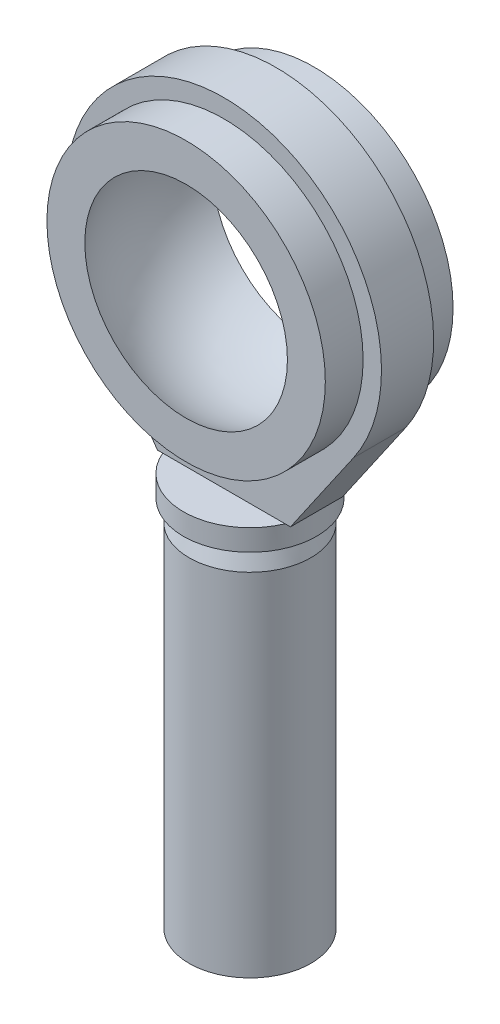
ISO-10303-21;
HEADER;
FILE_DESCRIPTION(('STEP AP214'),'2;1');
FILE_NAME('part.step','',(''),(''),'','','');
FILE_SCHEMA(('AUTOMOTIVE_DESIGN { 1 0 10303 214 1 1 1 1 }'));
ENDSEC;
DATA;
#1=APPLICATION_CONTEXT('core data for automotive mechanical design processes');
#2=APPLICATION_PROTOCOL_DEFINITION('international standard','automotive_design',2000,#1);
#3=PRODUCT_CONTEXT('',#1,'mechanical');
#4=PRODUCT('Part','Part','',(#3));
#5=PRODUCT_RELATED_PRODUCT_CATEGORY('part','',(#4));
#6=PRODUCT_DEFINITION_FORMATION('','',#4);
#7=PRODUCT_DEFINITION_CONTEXT('part definition',#1,'design');
#8=PRODUCT_DEFINITION('design','',#6,#7);
#9=PRODUCT_DEFINITION_SHAPE('','',#8);
#10=(LENGTH_UNIT() NAMED_UNIT(*) SI_UNIT(.MILLI.,.METRE.));
#11=(NAMED_UNIT(*) PLANE_ANGLE_UNIT() SI_UNIT($,.RADIAN.));
#12=(NAMED_UNIT(*) SI_UNIT($,.STERADIAN.) SOLID_ANGLE_UNIT());
#13=UNCERTAINTY_MEASURE_WITH_UNIT(LENGTH_MEASURE(1.E-05),#10,'distance_accuracy_value','');
#14=(GEOMETRIC_REPRESENTATION_CONTEXT(3) GLOBAL_UNCERTAINTY_ASSIGNED_CONTEXT((#13)) GLOBAL_UNIT_ASSIGNED_CONTEXT((#10,
#11,#12)) REPRESENTATION_CONTEXT('',''));
#15=CARTESIAN_POINT('',(0.,0.,0.));
#16=DIRECTION('',(0.,0.,1.));
#17=DIRECTION('',(1.,0.,0.));
#18=AXIS2_PLACEMENT_3D('',#15,#16,#17);
#19=CARTESIAN_POINT('',(0.,-54.,0.));
#20=DIRECTION('',(0.,1.,0.));
#21=DIRECTION('',(-1.,0.,0.));
#22=AXIS2_PLACEMENT_3D('',#19,#20,#21);
#23=PLANE('',#22);
#24=CARTESIAN_POINT('',(0.,-54.,0.));
#25=DIRECTION('',(0.,1.,0.));
#26=DIRECTION('',(-1.,0.,0.));
#27=AXIS2_PLACEMENT_3D('',#24,#25,#26);
#28=CIRCLE('',#27,5.725);
#29=CARTESIAN_POINT('',(-5.725,-54.,0.));
#30=VERTEX_POINT('',#29);
#31=EDGE_CURVE('E11',#30,#30,#28,.T.);
#32=ORIENTED_EDGE('',*,*,#31,.F.);
#33=EDGE_LOOP('',(#32));
#34=FACE_BOUND('',#33,.T.);
#35=ADVANCED_FACE('F43',(#34),#23,.F.);
#36=CARTESIAN_POINT('',(0.,-19.,0.));
#37=DIRECTION('',(0.,1.,0.));
#38=DIRECTION('',(-1.,0.,0.));
#39=AXIS2_PLACEMENT_3D('',#36,#37,#38);
#40=CYLINDRICAL_SURFACE('',#39,5.725);
#41=CARTESIAN_POINT('',(0.,-21.,0.));
#42=DIRECTION('',(0.,1.,0.));
#43=DIRECTION('',(-1.,0.,0.));
#44=AXIS2_PLACEMENT_3D('',#41,#42,#43);
#45=CIRCLE('',#44,5.725);
#46=CARTESIAN_POINT('',(-5.725,-21.,0.));
#47=VERTEX_POINT('',#46);
#48=EDGE_CURVE('E49',#47,#47,#45,.T.);
#49=ORIENTED_EDGE('',*,*,#48,.F.);
#50=EDGE_LOOP('',(#49));
#51=FACE_BOUND('',#50,.T.);
#52=ORIENTED_EDGE('',*,*,#31,.T.);
#53=EDGE_LOOP('',(#52));
#54=FACE_BOUND('',#53,.T.);
#55=ADVANCED_FACE('F64',(#51,#54),#40,.T.);
#56=CARTESIAN_POINT('',(0.,-21.,0.));
#57=DIRECTION('',(0.,-1.,0.));
#58=DIRECTION('',(1.,0.,0.));
#59=AXIS2_PLACEMENT_3D('',#56,#57,#58);
#60=CONICAL_SURFACE('',#59,5.725,0.325495855236479);
#61=CARTESIAN_POINT('',(0.,-19.,0.));
#62=DIRECTION('',(0.,1.,0.));
#63=DIRECTION('',(-1.,0.,0.));
#64=AXIS2_PLACEMENT_3D('',#61,#62,#63);
#65=CIRCLE('',#64,5.05);
#66=CARTESIAN_POINT('',(-5.05,-19.,0.));
#67=VERTEX_POINT('',#66);
#68=EDGE_CURVE('E53',#67,#67,#65,.T.);
#69=ORIENTED_EDGE('',*,*,#68,.F.);
#70=EDGE_LOOP('',(#69));
#71=FACE_BOUND('',#70,.T.);
#72=ORIENTED_EDGE('',*,*,#48,.T.);
#73=EDGE_LOOP('',(#72));
#74=FACE_BOUND('',#73,.T.);
#75=ADVANCED_FACE('F62',(#71,#74),#60,.T.);
#76=CARTESIAN_POINT('',(0.,-19.,0.));
#77=DIRECTION('',(0.,-1.,0.));
#78=DIRECTION('',(1.,0.,0.));
#79=AXIS2_PLACEMENT_3D('',#76,#77,#78);
#80=PLANE('',#79);
#81=ORIENTED_EDGE('',*,*,#68,.T.);
#82=EDGE_LOOP('',(#81));
#83=FACE_BOUND('',#82,.T.);
#84=ADVANCED_FACE('F60',(#83),#80,.F.);
#85=CLOSED_SHELL('',(#35,#55,#75,#84));
#86=MANIFOLD_SOLID_BREP('B2',#85);
#87=CARTESIAN_POINT('',(0.,-17.,0.));
#88=DIRECTION('',(0.,1.,0.));
#89=DIRECTION('',(0.,0.,1.));
#90=AXIS2_PLACEMENT_3D('',#87,#88,#89);
#91=PLANE('',#90);
#92=CARTESIAN_POINT('',(0.,-17.,0.));
#93=DIRECTION('',(0.,1.,0.));
#94=DIRECTION('',(0.,0.,1.));
#95=AXIS2_PLACEMENT_3D('',#92,#93,#94);
#96=CIRCLE('',#95,6.25);
#97=CARTESIAN_POINT('',(5.74978260458602,-17.,-2.45));
#98=VERTEX_POINT('',#97);
#99=CARTESIAN_POINT('',(-5.74978260458602,-17.,-2.45));
#100=VERTEX_POINT('',#99);
#101=EDGE_CURVE('E234',#98,#100,#96,.T.);
#102=ORIENTED_EDGE('',*,*,#101,.T.);
#103=DIRECTION('',(1.,0.,0.));
#104=VECTOR('',#103,1.);
#105=CARTESIAN_POINT('',(6.25,-17.,-2.45));
#106=LINE('',#105,#104);
#107=EDGE_CURVE('E41',#100,#98,#106,.T.);
#108=ORIENTED_EDGE('',*,*,#107,.T.);
#109=EDGE_LOOP('',(#102,#108));
#110=FACE_BOUND('',#109,.T.);
#111=ADVANCED_FACE('F99',(#110),#91,.T.);
#112=CARTESIAN_POINT('',(0.,-17.,0.));
#113=DIRECTION('',(0.,-1.,0.));
#114=DIRECTION('',(0.,0.,-1.));
#115=AXIS2_PLACEMENT_3D('',#112,#113,#114);
#116=CYLINDRICAL_SURFACE('',#115,6.25);
#117=CARTESIAN_POINT('',(5.74978260458602,-17.,2.45));
#118=VERTEX_POINT('',#117);
#119=CARTESIAN_POINT('',(6.25,-17.,0.));
#120=VERTEX_POINT('',#119);
#121=EDGE_CURVE('E225',#118,#120,#96,.T.);
#122=ORIENTED_EDGE('',*,*,#121,.F.);
#123=CARTESIAN_POINT('',(-5.74978260458602,-17.,2.45));
#124=VERTEX_POINT('',#123);
#125=EDGE_CURVE('E228',#124,#118,#96,.T.);
#126=ORIENTED_EDGE('',*,*,#125,.F.);
#127=CARTESIAN_POINT('',(-6.25,-17.,0.));
#128=VERTEX_POINT('',#127);
#129=EDGE_CURVE('E123',#128,#124,#96,.T.);
#130=ORIENTED_EDGE('',*,*,#129,.F.);
#131=EDGE_CURVE('E235',#100,#128,#96,.T.);
#132=ORIENTED_EDGE('',*,*,#131,.F.);
#133=ORIENTED_EDGE('',*,*,#101,.F.);
#134=EDGE_CURVE('E227',#120,#98,#96,.T.);
#135=ORIENTED_EDGE('',*,*,#134,.F.);
#136=EDGE_LOOP('',(#122,#126,#130,#132,#133,#135));
#137=FACE_BOUND('',#136,.T.);
#138=CARTESIAN_POINT('',(0.,-19.,0.));
#139=DIRECTION('',(0.,1.,0.));
#140=DIRECTION('',(0.,0.,1.));
#141=AXIS2_PLACEMENT_3D('',#138,#139,#140);
#142=CIRCLE('',#141,6.25);
#143=CARTESIAN_POINT('',(0.,-19.,6.25));
#144=VERTEX_POINT('',#143);
#145=EDGE_CURVE('E103',#144,#144,#142,.T.);
#146=ORIENTED_EDGE('',*,*,#145,.T.);
#147=EDGE_LOOP('',(#146));
#148=FACE_BOUND('',#147,.T.);
#149=ADVANCED_FACE('F101',(#137,#148),#116,.T.);
#150=DIRECTION('',(1.,0.,0.));
#151=VECTOR('',#150,1.);
#152=CARTESIAN_POINT('',(6.25,-17.,2.45));
#153=LINE('',#152,#151);
#154=EDGE_CURVE('E108',#124,#118,#153,.T.);
#155=ORIENTED_EDGE('',*,*,#154,.F.);
#156=ORIENTED_EDGE('',*,*,#125,.T.);
#157=EDGE_LOOP('',(#155,#156));
#158=FACE_BOUND('',#157,.T.);
#159=ADVANCED_FACE('F243',(#158),#91,.T.);
#160=CARTESIAN_POINT('',(0.,-19.,0.));
#161=DIRECTION('',(0.,1.,0.));
#162=DIRECTION('',(0.,0.,1.));
#163=AXIS2_PLACEMENT_3D('',#160,#161,#162);
#164=PLANE('',#163);
#165=ORIENTED_EDGE('',*,*,#145,.F.);
#166=EDGE_LOOP('',(#165));
#167=FACE_BOUND('',#166,.T.);
#168=ADVANCED_FACE('F240',(#167),#164,.F.);
#169=CARTESIAN_POINT('',(6.25,-17.,2.45));
#170=DIRECTION('',(0.,1.,0.));
#171=DIRECTION('',(0.,0.,1.));
#172=AXIS2_PLACEMENT_3D('',#169,#170,#171);
#173=PLANE('',#172);
#174=CARTESIAN_POINT('',(6.25,-17.,2.45));
#175=VERTEX_POINT('',#174);
#176=EDGE_CURVE('E213',#118,#175,#153,.T.);
#177=ORIENTED_EDGE('',*,*,#176,.F.);
#178=ORIENTED_EDGE('',*,*,#121,.T.);
#179=DIRECTION('',(0.,0.,-1.));
#180=VECTOR('',#179,1.);
#181=CARTESIAN_POINT('',(6.25,-17.,2.45));
#182=LINE('',#181,#180);
#183=EDGE_CURVE('E219',#175,#120,#182,.T.);
#184=ORIENTED_EDGE('',*,*,#183,.F.);
#185=EDGE_LOOP('',(#177,#178,#184));
#186=FACE_BOUND('',#185,.T.);
#187=ADVANCED_FACE('F242',(#186),#173,.F.);
#188=CARTESIAN_POINT('',(6.25,-17.,-2.45));
#189=VERTEX_POINT('',#188);
#190=EDGE_CURVE('E217',#120,#189,#182,.T.);
#191=ORIENTED_EDGE('',*,*,#190,.F.);
#192=ORIENTED_EDGE('',*,*,#134,.T.);
#193=EDGE_CURVE('E111',#98,#189,#106,.T.);
#194=ORIENTED_EDGE('',*,*,#193,.T.);
#195=EDGE_LOOP('',(#191,#192,#194));
#196=FACE_BOUND('',#195,.T.);
#197=ADVANCED_FACE('F248',(#196),#173,.F.);
#198=CARTESIAN_POINT('',(-6.25,-17.,-2.45));
#199=VERTEX_POINT('',#198);
#200=EDGE_CURVE('E110',#199,#100,#106,.T.);
#201=ORIENTED_EDGE('',*,*,#200,.T.);
#202=ORIENTED_EDGE('',*,*,#131,.T.);
#203=DIRECTION('',(0.,0.,-1.));
#204=VECTOR('',#203,1.);
#205=CARTESIAN_POINT('',(-6.25,-17.,2.45));
#206=LINE('',#205,#204);
#207=EDGE_CURVE('E222',#128,#199,#206,.T.);
#208=ORIENTED_EDGE('',*,*,#207,.T.);
#209=EDGE_LOOP('',(#201,#202,#208));
#210=FACE_BOUND('',#209,.T.);
#211=ADVANCED_FACE('F343',(#210),#173,.F.);
#212=CARTESIAN_POINT('',(-6.25,-17.,2.45));
#213=VERTEX_POINT('',#212);
#214=EDGE_CURVE('E184',#213,#128,#206,.T.);
#215=ORIENTED_EDGE('',*,*,#214,.T.);
#216=ORIENTED_EDGE('',*,*,#129,.T.);
#217=EDGE_CURVE('E214',#213,#124,#153,.T.);
#218=ORIENTED_EDGE('',*,*,#217,.F.);
#219=EDGE_LOOP('',(#215,#216,#218));
#220=FACE_BOUND('',#219,.T.);
#221=ADVANCED_FACE('F250',(#220),#173,.F.);
#222=CARTESIAN_POINT('',(6.25,-17.,2.45));
#223=DIRECTION('',(-0.823024661867632,0.568005639019253,0.));
#224=DIRECTION('',(-0.568005639019253,-0.823024661867632,0.));
#225=AXIS2_PLACEMENT_3D('',#222,#223,#224);
#226=PLANE('',#225);
#227=DIRECTION('',(0.568005639019253,0.823024661867632,0.));
#228=VECTOR('',#227,1.);
#229=CARTESIAN_POINT('',(6.25,-17.,-2.45));
#230=LINE('',#229,#228);
#231=CARTESIAN_POINT('',(12.180764995641,-8.40648345748495,-2.45));
#232=VERTEX_POINT('',#231);
#233=EDGE_CURVE('E173',#189,#232,#230,.T.);
#234=ORIENTED_EDGE('',*,*,#233,.T.);
#235=DIRECTION('',(0.,0.,-1.));
#236=VECTOR('',#235,1.);
#237=CARTESIAN_POINT('',(12.180764995641,-8.40648345748495,2.45));
#238=LINE('',#237,#236);
#239=CARTESIAN_POINT('',(12.180764995641,-8.40648345748495,2.45));
#240=VERTEX_POINT('',#239);
#241=EDGE_CURVE('E183',#240,#232,#238,.T.);
#242=ORIENTED_EDGE('',*,*,#241,.F.);
#243=DIRECTION('',(0.568005639019253,0.823024661867632,0.));
#244=VECTOR('',#243,1.);
#245=CARTESIAN_POINT('',(6.25,-17.,2.45));
#246=LINE('',#245,#244);
#247=EDGE_CURVE('E210',#175,#240,#246,.T.);
#248=ORIENTED_EDGE('',*,*,#247,.F.);
#249=ORIENTED_EDGE('',*,*,#183,.T.);
#250=ORIENTED_EDGE('',*,*,#190,.T.);
#251=EDGE_LOOP('',(#234,#242,#248,#249,#250));
#252=FACE_BOUND('',#251,.T.);
#253=ADVANCED_FACE('F259',(#252),#226,.F.);
#254=CARTESIAN_POINT('',(-6.25,-17.,2.45));
#255=DIRECTION('',(0.823024661867632,0.568005639019253,0.));
#256=DIRECTION('',(-0.568005639019253,0.823024661867632,0.));
#257=AXIS2_PLACEMENT_3D('',#254,#255,#256);
#258=PLANE('',#257);
#259=DIRECTION('',(0.568005639019253,-0.823024661867632,0.));
#260=VECTOR('',#259,1.);
#261=CARTESIAN_POINT('',(-6.25,-17.,-2.45));
#262=LINE('',#261,#260);
#263=CARTESIAN_POINT('',(-12.180764995641,-8.40648345748494,-2.45));
#264=VERTEX_POINT('',#263);
#265=EDGE_CURVE('E162',#264,#199,#262,.T.);
#266=ORIENTED_EDGE('',*,*,#265,.T.);
#267=ORIENTED_EDGE('',*,*,#207,.F.);
#268=ORIENTED_EDGE('',*,*,#214,.F.);
#269=DIRECTION('',(0.568005639019253,-0.823024661867632,0.));
#270=VECTOR('',#269,1.);
#271=CARTESIAN_POINT('',(-6.25,-17.,2.45));
#272=LINE('',#271,#270);
#273=CARTESIAN_POINT('',(-12.180764995641,-8.40648345748494,2.45));
#274=VERTEX_POINT('',#273);
#275=EDGE_CURVE('E179',#274,#213,#272,.T.);
#276=ORIENTED_EDGE('',*,*,#275,.F.);
#277=DIRECTION('',(0.,0.,-1.));
#278=VECTOR('',#277,1.);
#279=CARTESIAN_POINT('',(-12.180764995641,-8.40648345748494,2.45));
#280=LINE('',#279,#278);
#281=EDGE_CURVE('E176',#274,#264,#280,.T.);
#282=ORIENTED_EDGE('',*,*,#281,.T.);
#283=EDGE_LOOP('',(#266,#267,#268,#276,#282));
#284=FACE_BOUND('',#283,.T.);
#285=ADVANCED_FACE('F177',(#284),#258,.F.);
#286=CARTESIAN_POINT('',(0.,0.,2.45));
#287=DIRECTION('',(0.,0.,1.));
#288=DIRECTION('',(1.,0.,0.));
#289=AXIS2_PLACEMENT_3D('',#286,#287,#288);
#290=PLANE('',#289);
#291=ORIENTED_EDGE('',*,*,#247,.T.);
#292=CARTESIAN_POINT('',(0.,0.,2.45));
#293=DIRECTION('',(0.,0.,1.));
#294=DIRECTION('',(1.,0.,0.));
#295=AXIS2_PLACEMENT_3D('',#292,#293,#294);
#296=CIRCLE('',#295,14.8);
#297=EDGE_CURVE('E189',#240,#274,#296,.T.);
#298=ORIENTED_EDGE('',*,*,#297,.T.);
#299=ORIENTED_EDGE('',*,*,#275,.T.);
#300=ORIENTED_EDGE('',*,*,#217,.T.);
#301=ORIENTED_EDGE('',*,*,#154,.T.);
#302=ORIENTED_EDGE('',*,*,#176,.T.);
#303=EDGE_LOOP('',(#291,#298,#299,#300,#301,#302));
#304=FACE_BOUND('',#303,.T.);
#305=CARTESIAN_POINT('',(0.,0.,2.45));
#306=DIRECTION('',(0.,0.,1.));
#307=DIRECTION('',(1.,0.,0.));
#308=AXIS2_PLACEMENT_3D('',#305,#306,#307);
#309=CIRCLE('',#308,13.075);
#310=CARTESIAN_POINT('',(13.075,0.,2.45));
#311=VERTEX_POINT('',#310);
#312=EDGE_CURVE('E192',#311,#311,#309,.T.);
#313=ORIENTED_EDGE('',*,*,#312,.F.);
#314=EDGE_LOOP('',(#313));
#315=FACE_BOUND('',#314,.T.);
#316=ADVANCED_FACE('F264',(#304,#315),#290,.T.);
#317=CARTESIAN_POINT('',(0.,0.,-2.45));
#318=DIRECTION('',(0.,0.,1.));
#319=DIRECTION('',(1.,0.,0.));
#320=AXIS2_PLACEMENT_3D('',#317,#318,#319);
#321=PLANE('',#320);
#322=ORIENTED_EDGE('',*,*,#233,.F.);
#323=ORIENTED_EDGE('',*,*,#193,.F.);
#324=ORIENTED_EDGE('',*,*,#107,.F.);
#325=ORIENTED_EDGE('',*,*,#200,.F.);
#326=ORIENTED_EDGE('',*,*,#265,.F.);
#327=CARTESIAN_POINT('',(0.,0.,-2.45));
#328=DIRECTION('',(0.,0.,1.));
#329=DIRECTION('',(1.,0.,0.));
#330=AXIS2_PLACEMENT_3D('',#327,#328,#329);
#331=CIRCLE('',#330,14.8);
#332=EDGE_CURVE('E168',#232,#264,#331,.T.);
#333=ORIENTED_EDGE('',*,*,#332,.F.);
#334=EDGE_LOOP('',(#322,#323,#324,#325,#326,#333));
#335=FACE_BOUND('',#334,.T.);
#336=CARTESIAN_POINT('',(0.,0.,-2.45));
#337=DIRECTION('',(0.,0.,1.));
#338=DIRECTION('',(1.,0.,0.));
#339=AXIS2_PLACEMENT_3D('',#336,#337,#338);
#340=CIRCLE('',#339,13.075);
#341=CARTESIAN_POINT('',(13.075,0.,-2.45));
#342=VERTEX_POINT('',#341);
#343=EDGE_CURVE('E202',#342,#342,#340,.T.);
#344=ORIENTED_EDGE('',*,*,#343,.T.);
#345=EDGE_LOOP('',(#344));
#346=FACE_BOUND('',#345,.T.);
#347=ADVANCED_FACE('F165',(#335,#346),#321,.F.);
#348=CARTESIAN_POINT('',(0.,0.,6.));
#349=DIRECTION('',(0.,0.,-1.));
#350=DIRECTION('',(-1.,0.,0.));
#351=AXIS2_PLACEMENT_3D('',#348,#349,#350);
#352=CYLINDRICAL_SURFACE('',#351,13.075);
#353=ORIENTED_EDGE('',*,*,#312,.T.);
#354=EDGE_LOOP('',(#353));
#355=FACE_BOUND('',#354,.T.);
#356=CARTESIAN_POINT('',(0.,0.,6.));
#357=DIRECTION('',(0.,0.,1.));
#358=DIRECTION('',(1.,0.,0.));
#359=AXIS2_PLACEMENT_3D('',#356,#357,#358);
#360=CIRCLE('',#359,13.075);
#361=CARTESIAN_POINT('',(13.075,0.,6.));
#362=VERTEX_POINT('',#361);
#363=EDGE_CURVE('E199',#362,#362,#360,.T.);
#364=ORIENTED_EDGE('',*,*,#363,.F.);
#365=EDGE_LOOP('',(#364));
#366=FACE_BOUND('',#365,.T.);
#367=ADVANCED_FACE('F268',(#355,#366),#352,.T.);
#368=CARTESIAN_POINT('',(0.,0.,6.));
#369=DIRECTION('',(0.,0.,1.));
#370=DIRECTION('',(1.,0.,0.));
#371=AXIS2_PLACEMENT_3D('',#368,#369,#370);
#372=PLANE('',#371);
#373=CARTESIAN_POINT('',(0.,0.,6.));
#374=DIRECTION('',(0.,0.,1.));
#375=DIRECTION('',(1.,0.,0.));
#376=AXIS2_PLACEMENT_3D('',#373,#374,#375);
#377=CIRCLE('',#376,9.51643315533714);
#378=CARTESIAN_POINT('',(0.,-9.51643315533714,6.));
#379=VERTEX_POINT('',#378);
#380=EDGE_CURVE('E190',#379,#379,#377,.T.);
#381=ORIENTED_EDGE('',*,*,#380,.F.);
#382=EDGE_LOOP('',(#381));
#383=FACE_BOUND('',#382,.T.);
#384=ORIENTED_EDGE('',*,*,#363,.T.);
#385=EDGE_LOOP('',(#384));
#386=FACE_BOUND('',#385,.T.);
#387=ADVANCED_FACE('F274',(#383,#386),#372,.T.);
#388=CARTESIAN_POINT('',(0.,0.,2.45));
#389=DIRECTION('',(0.,0.,-1.));
#390=DIRECTION('',(-1.,0.,0.));
#391=AXIS2_PLACEMENT_3D('',#388,#389,#390);
#392=CYLINDRICAL_SURFACE('',#391,14.8);
#393=ORIENTED_EDGE('',*,*,#241,.T.);
#394=ORIENTED_EDGE('',*,*,#332,.T.);
#395=ORIENTED_EDGE('',*,*,#281,.F.);
#396=ORIENTED_EDGE('',*,*,#297,.F.);
#397=EDGE_LOOP('',(#393,#394,#395,#396));
#398=FACE_BOUND('',#397,.T.);
#399=ADVANCED_FACE('F187',(#398),#392,.T.);
#400=CARTESIAN_POINT('',(0.,0.,-6.));
#401=DIRECTION('',(0.,0.,1.));
#402=DIRECTION('',(1.,0.,0.));
#403=AXIS2_PLACEMENT_3D('',#400,#401,#402);
#404=PLANE('',#403);
#405=CARTESIAN_POINT('',(0.,0.,-6.));
#406=DIRECTION('',(0.,0.,1.));
#407=DIRECTION('',(1.,0.,0.));
#408=AXIS2_PLACEMENT_3D('',#405,#406,#407);
#409=CIRCLE('',#408,9.51643315533714);
#410=CARTESIAN_POINT('',(0.,-9.51643315533714,-6.));
#411=VERTEX_POINT('',#410);
#412=EDGE_CURVE('E195',#411,#411,#409,.T.);
#413=ORIENTED_EDGE('',*,*,#412,.T.);
#414=EDGE_LOOP('',(#413));
#415=FACE_BOUND('',#414,.T.);
#416=CARTESIAN_POINT('',(0.,0.,-6.));
#417=DIRECTION('',(0.,0.,1.));
#418=DIRECTION('',(1.,0.,0.));
#419=AXIS2_PLACEMENT_3D('',#416,#417,#418);
#420=CIRCLE('',#419,13.075);
#421=CARTESIAN_POINT('',(13.075,0.,-6.));
#422=VERTEX_POINT('',#421);
#423=EDGE_CURVE('E203',#422,#422,#420,.T.);
#424=ORIENTED_EDGE('',*,*,#423,.F.);
#425=EDGE_LOOP('',(#424));
#426=FACE_BOUND('',#425,.T.);
#427=ADVANCED_FACE('F277',(#415,#426),#404,.F.);
#428=ORIENTED_EDGE('',*,*,#423,.T.);
#429=EDGE_LOOP('',(#428));
#430=FACE_BOUND('',#429,.T.);
#431=ORIENTED_EDGE('',*,*,#343,.F.);
#432=EDGE_LOOP('',(#431));
#433=FACE_BOUND('',#432,.T.);
#434=ADVANCED_FACE('F276',(#430,#433),#352,.T.);
#435=CARTESIAN_POINT('',(0.,0.,0.));
#436=DIRECTION('',(0.,0.,-1.));
#437=DIRECTION('',(0.,-1.,0.));
#438=AXIS2_PLACEMENT_3D('',#435,#436,#437);
#439=SPHERICAL_SURFACE('',#438,11.25);
#440=CARTESIAN_POINT('',(0.,-9.51643315533714,6.));
#441=CARTESIAN_POINT('',(0.,-9.58675107438232,5.88847263189662));
#442=CARTESIAN_POINT('',(0.,-9.65510667408107,5.7757081184078));
#443=CARTESIAN_POINT('',(0.,-9.78781265196401,5.54784645075921));
#444=CARTESIAN_POINT('',(0.,-9.85216303014819,5.43274929659945));
#445=CARTESIAN_POINT('',(0.,-9.97677798218029,5.20036399770893));
#446=CARTESIAN_POINT('',(0.,-10.0370425560282,5.08307585297816));
#447=CARTESIAN_POINT('',(0.,-10.1534116930587,4.84645370362874));
#448=CARTESIAN_POINT('',(0.,-10.2095162562412,4.72711969901007));
#449=CARTESIAN_POINT('',(0.,-10.3174959519347,4.48655328223882));
#450=CARTESIAN_POINT('',(0.,-10.3693710844457,4.36532087008623));
#451=CARTESIAN_POINT('',(0.,-10.4688278215759,4.12110749248652));
#452=CARTESIAN_POINT('',(0.,-10.5164094261952,3.99812652703939));
#453=CARTESIAN_POINT('',(0.,-10.6072202915779,3.75056804342922));
#454=CARTESIAN_POINT('',(0.,-10.6504495523413,3.62599052526619));
#455=CARTESIAN_POINT('',(0.,-10.7325023003559,3.37539291411446));
#456=CARTESIAN_POINT('',(0.,-10.771325787607,3.24937282112577));
#457=CARTESIAN_POINT('',(0.,-10.8445190026177,2.99604582015956));
#458=CARTESIAN_POINT('',(0.,-10.8788887303772,2.86873891218205));
#459=CARTESIAN_POINT('',(0.,-10.9431319457356,2.61299563185641));
#460=CARTESIAN_POINT('',(0.,-10.9730054333344,2.48455925950828));
#461=CARTESIAN_POINT('',(0.,-11.0282192448961,2.22671579699401));
#462=CARTESIAN_POINT('',(0.,-11.0535595688589,2.09730870682788));
#463=CARTESIAN_POINT('',(0.,-11.0996757326709,1.83768375505203));
#464=CARTESIAN_POINT('',(0.,-11.1204515725201,1.70746589344232));
#465=CARTESIAN_POINT('',(0.,-11.1574130892922,1.44638034725677));
#466=CARTESIAN_POINT('',(0.,-11.1735987662151,1.31551266268093));
#467=CARTESIAN_POINT('',(0.,-11.2013599517377,1.05328922221926));
#468=CARTESIAN_POINT('',(0.,-11.2129354603374,0.921933466333433));
#469=CARTESIAN_POINT('',(0.,-11.2314620019557,0.658896238160659));
#470=CARTESIAN_POINT('',(0.,-11.2384130349744,0.527214765873716));
#471=CARTESIAN_POINT('',(0.,-11.2476820339965,0.263688862391182));
#472=CARTESIAN_POINT('',(0.,-11.25,0.131844431195591));
#473=CARTESIAN_POINT('',(0.,-11.25,-0.131844431195591));
#474=CARTESIAN_POINT('',(0.,-11.2476820339965,-0.263688862391182));
#475=CARTESIAN_POINT('',(0.,-11.2384130349744,-0.527214765873716));
#476=CARTESIAN_POINT('',(0.,-11.2314620019557,-0.658896238160658));
#477=CARTESIAN_POINT('',(0.,-11.2129354603374,-0.921933466333432));
#478=CARTESIAN_POINT('',(0.,-11.2013599517377,-1.05328922221926));
#479=CARTESIAN_POINT('',(0.,-11.1735987662151,-1.31551266268093));
#480=CARTESIAN_POINT('',(0.,-11.1574130892922,-1.44638034725677));
#481=CARTESIAN_POINT('',(0.,-11.1204515725201,-1.70746589344232));
#482=CARTESIAN_POINT('',(0.,-11.0996757326709,-1.83768375505203));
#483=CARTESIAN_POINT('',(0.,-11.0535595688589,-2.09730870682788));
#484=CARTESIAN_POINT('',(0.,-11.0282192448961,-2.22671579699401));
#485=CARTESIAN_POINT('',(0.,-10.9730054333344,-2.48455925950828));
#486=CARTESIAN_POINT('',(0.,-10.9431319457356,-2.61299563185641));
#487=CARTESIAN_POINT('',(0.,-10.8788887303772,-2.86873891218205));
#488=CARTESIAN_POINT('',(0.,-10.8445190026177,-2.99604582015956));
#489=CARTESIAN_POINT('',(0.,-10.771325787607,-3.24937282112577));
#490=CARTESIAN_POINT('',(0.,-10.7325023003559,-3.37539291411446));
#491=CARTESIAN_POINT('',(0.,-10.6504495523413,-3.62599052526619));
#492=CARTESIAN_POINT('',(0.,-10.6072202915779,-3.75056804342922));
#493=CARTESIAN_POINT('',(0.,-10.5164094261952,-3.99812652703939));
#494=CARTESIAN_POINT('',(0.,-10.4688278215759,-4.12110749248652));
#495=CARTESIAN_POINT('',(0.,-10.3693710844457,-4.36532087008623));
#496=CARTESIAN_POINT('',(0.,-10.3174959519347,-4.48655328223882));
#497=CARTESIAN_POINT('',(0.,-10.2095162562412,-4.72711969901007));
#498=CARTESIAN_POINT('',(0.,-10.1534116930587,-4.84645370362874));
#499=CARTESIAN_POINT('',(0.,-10.0370425560282,-5.08307585297816));
#500=CARTESIAN_POINT('',(0.,-9.97677798218029,-5.20036399770893));
#501=CARTESIAN_POINT('',(0.,-9.85216303014819,-5.43274929659945));
#502=CARTESIAN_POINT('',(0.,-9.78781265196401,-5.54784645075921));
#503=CARTESIAN_POINT('',(0.,-9.65510667408107,-5.7757081184078));
#504=CARTESIAN_POINT('',(0.,-9.58675107438232,-5.88847263189662));
#505=CARTESIAN_POINT('',(0.,-9.51643315533714,-6.));
#506=B_SPLINE_CURVE_WITH_KNOTS('',3,(#440,#441,#442,#443,#444,#445,#446,#447,#448,#449,#450,
#451,#452,#453,#454,#455,#456,#457,#458,#459,#460,#461,#462,#463,#464,#465,#466,#467,#468,#469,
#470,#471,#472,#473,#474,#475,#476,#477,#478,#479,#480,#481,#482,#483,#484,#485,#486,#487,#488,
#489,#490,#491,#492,#493,#494,#495,#496,#497,#498,#499,#500,#501,#502,#503,#504,#505),
.UNSPECIFIED.,.F.,.F.,(4,2,2,2,2,2,2,2,2,2,2,2,2,2,2,2,2,2,2,2,2,2,2,2,2,2,2,2,2,2,2,2,4),(0.,
0.395512925297487,0.791025850594975,1.18653877589246,1.58205170118995,1.97756462648744,
2.37307755178493,2.76859047708242,3.1641034023799,3.55961632767739,3.95512925297488,
4.35064217827237,4.74615510356985,5.14166802886734,5.53718095416483,5.93269387946232,
6.32820680475981,6.72371973005729,7.11923265535478,7.51474558065227,7.91025850594976,
8.30577143124725,8.70128435654473,9.09679728184222,9.49231020713971,9.8878231324372,
10.2833360577347,10.6788489830322,11.0743619083297,11.4698748336271,11.8653877589246,
12.2609006842221,12.6564136095196),.UNSPECIFIED.);
#507=EDGE_CURVE('BSEAM286',#379,#411,#506,.T.);
#508=ORIENTED_EDGE('',*,*,#380,.T.);
#509=ORIENTED_EDGE('',*,*,#412,.F.);
#510=ORIENTED_EDGE('',*,*,#507,.T.);
#511=ORIENTED_EDGE('',*,*,#507,.F.);
#512=EDGE_LOOP('',(#508,#510,#509,#511));
#513=FACE_BOUND('',#512,.T.);
#514=ADVANCED_FACE('F286',(#513),#439,.F.);
#515=CLOSED_SHELL('',(#111,#149,#159,#168,#187,#197,#211,#221,#253,#285,#316,#347,#367,#387,
#399,#427,#434,#514));
#516=MANIFOLD_SOLID_BREP('B6',#515);
#517=ADVANCED_BREP_SHAPE_REPRESENTATION('',(#18,#86,#516),#14);
#518=SHAPE_DEFINITION_REPRESENTATION(#9,#517);
ENDSEC;
END-ISO-10303-21;
